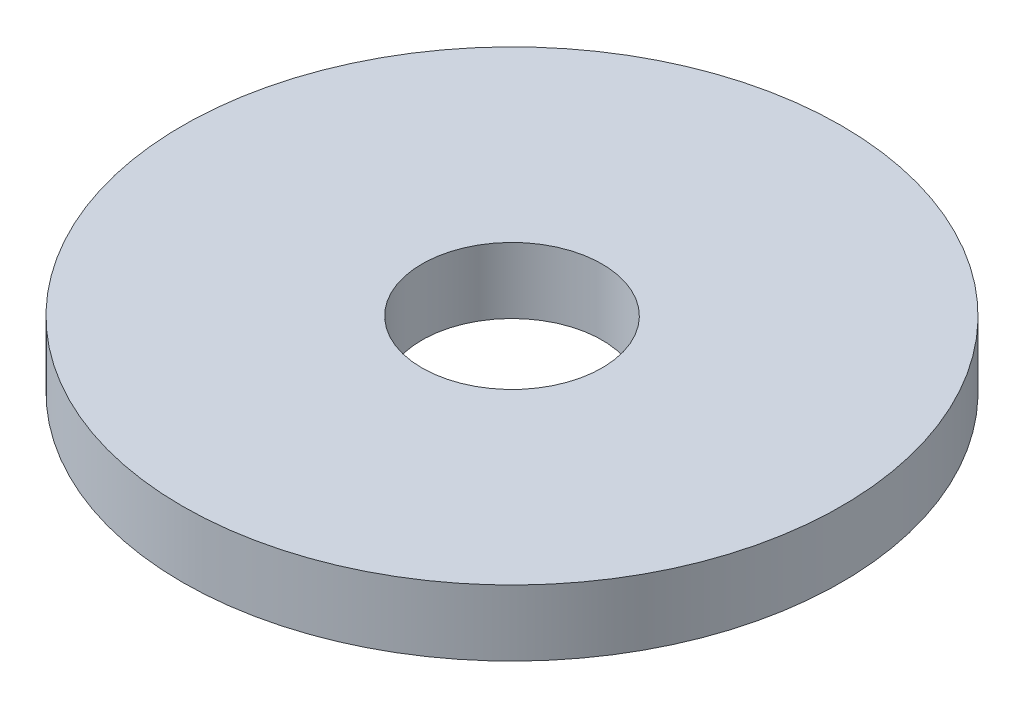
ISO-10303-21;
HEADER;
FILE_DESCRIPTION(('STEP AP214'),'2;1');
FILE_NAME('part.step','',(''),(''),'','','');
FILE_SCHEMA(('AUTOMOTIVE_DESIGN { 1 0 10303 214 1 1 1 1 }'));
ENDSEC;
DATA;
#1=APPLICATION_CONTEXT('core data for automotive mechanical design processes');
#2=APPLICATION_PROTOCOL_DEFINITION('international standard','automotive_design',2000,#1);
#3=PRODUCT_CONTEXT('',#1,'mechanical');
#4=PRODUCT('Part','Part','',(#3));
#5=PRODUCT_RELATED_PRODUCT_CATEGORY('part','',(#4));
#6=PRODUCT_DEFINITION_FORMATION('','',#4);
#7=PRODUCT_DEFINITION_CONTEXT('part definition',#1,'design');
#8=PRODUCT_DEFINITION('design','',#6,#7);
#9=PRODUCT_DEFINITION_SHAPE('','',#8);
#10=(LENGTH_UNIT() NAMED_UNIT(*) SI_UNIT(.MILLI.,.METRE.));
#11=(NAMED_UNIT(*) PLANE_ANGLE_UNIT() SI_UNIT($,.RADIAN.));
#12=(NAMED_UNIT(*) SI_UNIT($,.STERADIAN.) SOLID_ANGLE_UNIT());
#13=UNCERTAINTY_MEASURE_WITH_UNIT(LENGTH_MEASURE(1.E-05),#10,'distance_accuracy_value','');
#14=(GEOMETRIC_REPRESENTATION_CONTEXT(3) GLOBAL_UNCERTAINTY_ASSIGNED_CONTEXT((#13)) GLOBAL_UNIT_ASSIGNED_CONTEXT((#10,
#11,#12)) REPRESENTATION_CONTEXT('',''));
#15=CARTESIAN_POINT('',(0.,0.,0.));
#16=DIRECTION('',(0.,0.,1.));
#17=DIRECTION('',(1.,0.,0.));
#18=AXIS2_PLACEMENT_3D('',#15,#16,#17);
#19=CARTESIAN_POINT('',(0.,3.,0.));
#20=DIRECTION('',(0.,1.,0.));
#21=DIRECTION('',(0.,0.,1.));
#22=AXIS2_PLACEMENT_3D('',#19,#20,#21);
#23=PLANE('',#22);
#24=CARTESIAN_POINT('',(0.,3.,0.));
#25=DIRECTION('',(0.,1.,0.));
#26=DIRECTION('',(0.,0.,1.));
#27=AXIS2_PLACEMENT_3D('',#24,#25,#26);
#28=CIRCLE('',#27,15.);
#29=CARTESIAN_POINT('',(0.,3.,15.));
#30=VERTEX_POINT('',#29);
#31=EDGE_CURVE('E10',#30,#30,#28,.T.);
#32=ORIENTED_EDGE('',*,*,#31,.T.);
#33=EDGE_LOOP('',(#32));
#34=FACE_BOUND('',#33,.T.);
#35=CARTESIAN_POINT('',(0.,3.,0.));
#36=DIRECTION('',(0.,1.,0.));
#37=DIRECTION('',(0.,0.,1.));
#38=AXIS2_PLACEMENT_3D('',#35,#36,#37);
#39=CIRCLE('',#38,4.1);
#40=CARTESIAN_POINT('',(0.,3.,4.1));
#41=VERTEX_POINT('',#40);
#42=EDGE_CURVE('E43',#41,#41,#39,.T.);
#43=ORIENTED_EDGE('',*,*,#42,.F.);
#44=EDGE_LOOP('',(#43));
#45=FACE_BOUND('',#44,.T.);
#46=ADVANCED_FACE('F32',(#34,#45),#23,.T.);
#47=CARTESIAN_POINT('',(0.,0.,0.));
#48=DIRECTION('',(0.,1.,0.));
#49=DIRECTION('',(0.,0.,1.));
#50=AXIS2_PLACEMENT_3D('',#47,#48,#49);
#51=PLANE('',#50);
#52=CARTESIAN_POINT('',(0.,0.,0.));
#53=DIRECTION('',(0.,1.,0.));
#54=DIRECTION('',(0.,0.,1.));
#55=AXIS2_PLACEMENT_3D('',#52,#53,#54);
#56=CIRCLE('',#55,15.);
#57=CARTESIAN_POINT('',(0.,0.,15.));
#58=VERTEX_POINT('',#57);
#59=EDGE_CURVE('E36',#58,#58,#56,.T.);
#60=ORIENTED_EDGE('',*,*,#59,.F.);
#61=EDGE_LOOP('',(#60));
#62=FACE_BOUND('',#61,.T.);
#63=CARTESIAN_POINT('',(0.,0.,0.));
#64=DIRECTION('',(0.,1.,0.));
#65=DIRECTION('',(0.,0.,1.));
#66=AXIS2_PLACEMENT_3D('',#63,#64,#65);
#67=CIRCLE('',#66,4.1);
#68=CARTESIAN_POINT('',(0.,0.,4.1));
#69=VERTEX_POINT('',#68);
#70=EDGE_CURVE('E45',#69,#69,#67,.T.);
#71=ORIENTED_EDGE('',*,*,#70,.T.);
#72=EDGE_LOOP('',(#71));
#73=FACE_BOUND('',#72,.T.);
#74=ADVANCED_FACE('F55',(#62,#73),#51,.F.);
#75=CARTESIAN_POINT('',(0.,3.,0.));
#76=DIRECTION('',(0.,-1.,0.));
#77=DIRECTION('',(0.,0.,-1.));
#78=AXIS2_PLACEMENT_3D('',#75,#76,#77);
#79=CYLINDRICAL_SURFACE('',#78,15.);
#80=ORIENTED_EDGE('',*,*,#31,.F.);
#81=EDGE_LOOP('',(#80));
#82=FACE_BOUND('',#81,.T.);
#83=ORIENTED_EDGE('',*,*,#59,.T.);
#84=EDGE_LOOP('',(#83));
#85=FACE_BOUND('',#84,.T.);
#86=ADVANCED_FACE('F34',(#82,#85),#79,.T.);
#87=CARTESIAN_POINT('',(0.,3.,0.));
#88=DIRECTION('',(0.,-1.,0.));
#89=DIRECTION('',(0.,0.,-1.));
#90=AXIS2_PLACEMENT_3D('',#87,#88,#89);
#91=CYLINDRICAL_SURFACE('',#90,4.1);
#92=ORIENTED_EDGE('',*,*,#42,.T.);
#93=EDGE_LOOP('',(#92));
#94=FACE_BOUND('',#93,.T.);
#95=ORIENTED_EDGE('',*,*,#70,.F.);
#96=EDGE_LOOP('',(#95));
#97=FACE_BOUND('',#96,.T.);
#98=ADVANCED_FACE('F51',(#94,#97),#91,.F.);
#99=CLOSED_SHELL('',(#46,#74,#86,#98));
#100=MANIFOLD_SOLID_BREP('B2',#99);
#101=ADVANCED_BREP_SHAPE_REPRESENTATION('',(#18,#100),#14);
#102=SHAPE_DEFINITION_REPRESENTATION(#9,#101);
ENDSEC;
END-ISO-10303-21;
